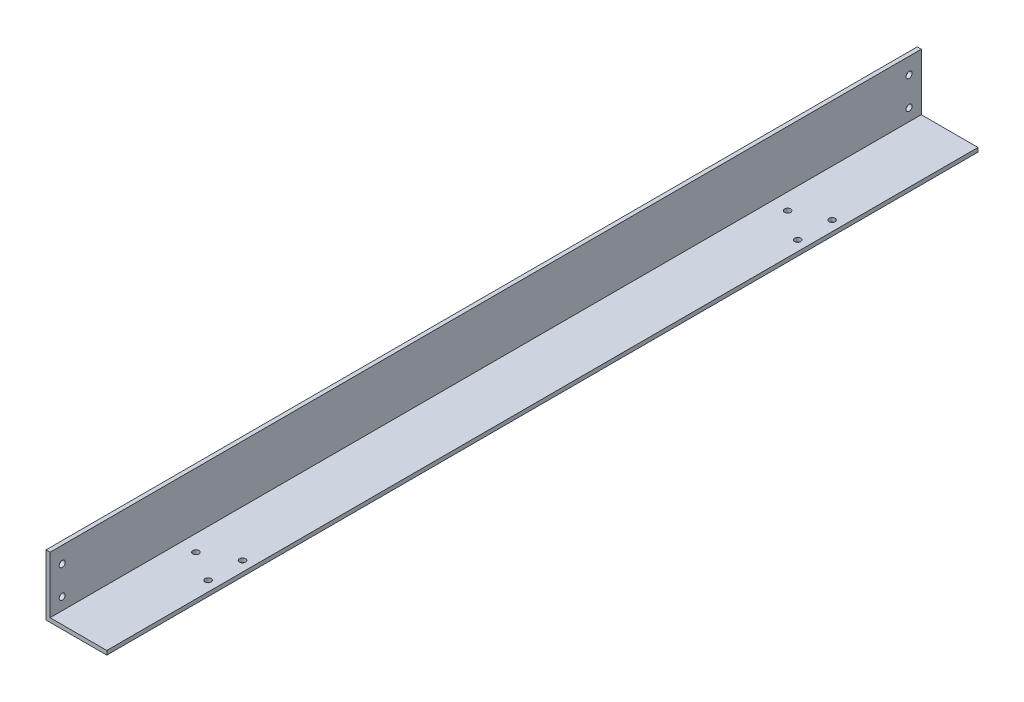
ISO-10303-21;
HEADER;
FILE_DESCRIPTION(('STEP AP214'),'2;1');
FILE_NAME('part.step','',(''),(''),'','','');
FILE_SCHEMA(('AUTOMOTIVE_DESIGN { 1 0 10303 214 1 1 1 1 }'));
ENDSEC;
DATA;
#1=APPLICATION_CONTEXT('core data for automotive mechanical design processes');
#2=APPLICATION_PROTOCOL_DEFINITION('international standard','automotive_design',2000,#1);
#3=PRODUCT_CONTEXT('',#1,'mechanical');
#4=PRODUCT('Part','Part','',(#3));
#5=PRODUCT_RELATED_PRODUCT_CATEGORY('part','',(#4));
#6=PRODUCT_DEFINITION_FORMATION('','',#4);
#7=PRODUCT_DEFINITION_CONTEXT('part definition',#1,'design');
#8=PRODUCT_DEFINITION('design','',#6,#7);
#9=PRODUCT_DEFINITION_SHAPE('','',#8);
#10=(LENGTH_UNIT() NAMED_UNIT(*) SI_UNIT(.MILLI.,.METRE.));
#11=(NAMED_UNIT(*) PLANE_ANGLE_UNIT() SI_UNIT($,.RADIAN.));
#12=(NAMED_UNIT(*) SI_UNIT($,.STERADIAN.) SOLID_ANGLE_UNIT());
#13=UNCERTAINTY_MEASURE_WITH_UNIT(LENGTH_MEASURE(1.E-05),#10,'distance_accuracy_value','');
#14=(GEOMETRIC_REPRESENTATION_CONTEXT(3) GLOBAL_UNCERTAINTY_ASSIGNED_CONTEXT((#13)) GLOBAL_UNIT_ASSIGNED_CONTEXT((#10,
#11,#12)) REPRESENTATION_CONTEXT('',''));
#15=CARTESIAN_POINT('',(0.,0.,0.));
#16=DIRECTION('',(0.,0.,1.));
#17=DIRECTION('',(1.,0.,0.));
#18=AXIS2_PLACEMENT_3D('',#15,#16,#17);
#19=CARTESIAN_POINT('',(30.,5.60231842899837,-19.999999999968));
#20=DIRECTION('',(0.,-1.,0.));
#21=DIRECTION('',(1.,0.,0.));
#22=AXIS2_PLACEMENT_3D('',#19,#20,#21);
#23=PLANE('',#22);
#24=CARTESIAN_POINT('',(25.,5.60231842899837,46.9999999999995));
#25=DIRECTION('',(0.,-1.,0.));
#26=DIRECTION('',(0.,0.,-1.));
#27=AXIS2_PLACEMENT_3D('',#24,#25,#26);
#28=CIRCLE('',#27,1.49999999999999);
#29=CARTESIAN_POINT('',(25.,5.60231842899837,45.4999999999995));
#30=VERTEX_POINT('',#29);
#31=EDGE_CURVE('E278',#30,#30,#28,.T.);
#32=ORIENTED_EDGE('',*,*,#31,.F.);
#33=EDGE_LOOP('',(#32));
#34=FACE_BOUND('',#33,.T.);
#35=CARTESIAN_POINT('',(25.,5.60231842899837,63.9999999999994));
#36=DIRECTION('',(0.,-1.,0.));
#37=DIRECTION('',(0.,0.,-1.));
#38=AXIS2_PLACEMENT_3D('',#35,#36,#37);
#39=CIRCLE('',#38,1.49999999999999);
#40=CARTESIAN_POINT('',(25.,5.60231842899837,62.4999999999995));
#41=VERTEX_POINT('',#40);
#42=EDGE_CURVE('E280',#41,#41,#39,.T.);
#43=ORIENTED_EDGE('',*,*,#42,.F.);
#44=EDGE_LOOP('',(#43));
#45=FACE_BOUND('',#44,.T.);
#46=CARTESIAN_POINT('',(9.99999999999999,5.60231842899837,53.9999999999994));
#47=DIRECTION('',(0.,-1.,0.));
#48=DIRECTION('',(0.,0.,-1.));
#49=AXIS2_PLACEMENT_3D('',#46,#47,#48);
#50=CIRCLE('',#49,1.49999999999999);
#51=CARTESIAN_POINT('',(9.99999999999999,5.60231842899837,52.4999999999995));
#52=VERTEX_POINT('',#51);
#53=EDGE_CURVE('E159',#52,#52,#50,.T.);
#54=ORIENTED_EDGE('',*,*,#53,.F.);
#55=EDGE_LOOP('',(#54));
#56=FACE_BOUND('',#55,.T.);
#57=CARTESIAN_POINT('',(25.,5.60231842899837,355.));
#58=DIRECTION('',(0.,-1.,0.));
#59=DIRECTION('',(0.,0.,-1.));
#60=AXIS2_PLACEMENT_3D('',#57,#58,#59);
#61=CIRCLE('',#60,1.49999999999999);
#62=CARTESIAN_POINT('',(25.,5.60231842899837,353.5));
#63=VERTEX_POINT('',#62);
#64=EDGE_CURVE('E148',#63,#63,#61,.T.);
#65=ORIENTED_EDGE('',*,*,#64,.F.);
#66=EDGE_LOOP('',(#65));
#67=FACE_BOUND('',#66,.T.);
#68=CARTESIAN_POINT('',(9.99999999999999,5.60231842899837,346.));
#69=DIRECTION('',(0.,-1.,0.));
#70=DIRECTION('',(0.,0.,-1.));
#71=AXIS2_PLACEMENT_3D('',#68,#69,#70);
#72=CIRCLE('',#71,1.49999999999999);
#73=CARTESIAN_POINT('',(9.99999999999999,5.60231842899837,344.5));
#74=VERTEX_POINT('',#73);
#75=EDGE_CURVE('E145',#74,#74,#72,.T.);
#76=ORIENTED_EDGE('',*,*,#75,.F.);
#77=EDGE_LOOP('',(#76));
#78=FACE_BOUND('',#77,.T.);
#79=CARTESIAN_POINT('',(25.,5.60231842899837,338.));
#80=DIRECTION('',(0.,-1.,0.));
#81=DIRECTION('',(0.,0.,-1.));
#82=AXIS2_PLACEMENT_3D('',#79,#80,#81);
#83=CIRCLE('',#82,1.49999999999999);
#84=CARTESIAN_POINT('',(25.,5.60231842899837,336.5));
#85=VERTEX_POINT('',#84);
#86=EDGE_CURVE('E144',#85,#85,#83,.T.);
#87=ORIENTED_EDGE('',*,*,#86,.F.);
#88=EDGE_LOOP('',(#87));
#89=FACE_BOUND('',#88,.T.);
#90=DIRECTION('',(0.,0.,1.));
#91=VECTOR('',#90,1.);
#92=CARTESIAN_POINT('',(30.,5.60231842899837,-19.999999999968));
#93=LINE('',#92,#91);
#94=CARTESIAN_POINT('',(30.,5.60231842899837,-19.999999999968));
#95=VERTEX_POINT('',#94);
#96=CARTESIAN_POINT('',(30.,5.60231842899837,410.));
#97=VERTEX_POINT('',#96);
#98=EDGE_CURVE('E87',#95,#97,#93,.T.);
#99=ORIENTED_EDGE('',*,*,#98,.T.);
#100=DIRECTION('',(1.,0.,0.));
#101=VECTOR('',#100,1.);
#102=CARTESIAN_POINT('',(30.,5.60231842899837,410.));
#103=LINE('',#102,#101);
#104=CARTESIAN_POINT('',(0.,5.60231842899837,410.));
#105=VERTEX_POINT('',#104);
#106=EDGE_CURVE('E90',#105,#97,#103,.T.);
#107=ORIENTED_EDGE('',*,*,#106,.F.);
#108=DIRECTION('',(0.,0.,1.));
#109=VECTOR('',#108,1.);
#110=CARTESIAN_POINT('',(0.,5.60231842899837,-19.999999999968));
#111=LINE('',#110,#109);
#112=CARTESIAN_POINT('',(0.,5.60231842899837,-19.999999999968));
#113=VERTEX_POINT('',#112);
#114=EDGE_CURVE('E11',#113,#105,#111,.T.);
#115=ORIENTED_EDGE('',*,*,#114,.F.);
#116=DIRECTION('',(1.,0.,0.));
#117=VECTOR('',#116,1.);
#118=CARTESIAN_POINT('',(30.,5.60231842899837,-19.999999999968));
#119=LINE('',#118,#117);
#120=EDGE_CURVE('E91',#113,#95,#119,.T.);
#121=ORIENTED_EDGE('',*,*,#120,.T.);
#122=EDGE_LOOP('',(#99,#107,#115,#121));
#123=FACE_BOUND('',#122,.T.);
#124=ADVANCED_FACE('F37',(#34,#45,#56,#67,#78,#89,#123),#23,.T.);
#125=CARTESIAN_POINT('',(0.,5.60231842899837,-19.999999999968));
#126=DIRECTION('',(-1.,0.,0.));
#127=DIRECTION('',(0.,0.,1.));
#128=AXIS2_PLACEMENT_3D('',#125,#126,#127);
#129=PLANE('',#128);
#130=CARTESIAN_POINT('',(0.,13.6023184289984,-14.0000000000006));
#131=DIRECTION('',(1.,0.,0.));
#132=DIRECTION('',(0.,0.,-1.));
#133=AXIS2_PLACEMENT_3D('',#130,#131,#132);
#134=CIRCLE('',#133,1.5);
#135=CARTESIAN_POINT('',(0.,13.6023184289984,-15.5000000000006));
#136=VERTEX_POINT('',#135);
#137=EDGE_CURVE('E171',#136,#136,#134,.T.);
#138=ORIENTED_EDGE('',*,*,#137,.T.);
#139=EDGE_LOOP('',(#138));
#140=FACE_BOUND('',#139,.T.);
#141=CARTESIAN_POINT('',(0.,27.6023184289984,-14.0000000000006));
#142=DIRECTION('',(1.,0.,0.));
#143=DIRECTION('',(0.,0.,-1.));
#144=AXIS2_PLACEMENT_3D('',#141,#142,#143);
#145=CIRCLE('',#144,1.5);
#146=CARTESIAN_POINT('',(0.,27.6023184289984,-15.5000000000006));
#147=VERTEX_POINT('',#146);
#148=EDGE_CURVE('E177',#147,#147,#145,.T.);
#149=ORIENTED_EDGE('',*,*,#148,.T.);
#150=EDGE_LOOP('',(#149));
#151=FACE_BOUND('',#150,.T.);
#152=CARTESIAN_POINT('',(0.,13.6023184289983,404.));
#153=DIRECTION('',(1.,0.,0.));
#154=DIRECTION('',(0.,0.,-1.));
#155=AXIS2_PLACEMENT_3D('',#152,#153,#154);
#156=CIRCLE('',#155,1.49999999999999);
#157=CARTESIAN_POINT('',(0.,13.6023184289983,402.5));
#158=VERTEX_POINT('',#157);
#159=EDGE_CURVE('E183',#158,#158,#156,.T.);
#160=ORIENTED_EDGE('',*,*,#159,.T.);
#161=EDGE_LOOP('',(#160));
#162=FACE_BOUND('',#161,.T.);
#163=CARTESIAN_POINT('',(0.,27.6023184289983,404.));
#164=DIRECTION('',(1.,0.,0.));
#165=DIRECTION('',(0.,0.,-1.));
#166=AXIS2_PLACEMENT_3D('',#163,#164,#165);
#167=CIRCLE('',#166,1.49999999999999);
#168=CARTESIAN_POINT('',(0.,27.6023184289983,402.5));
#169=VERTEX_POINT('',#168);
#170=EDGE_CURVE('E110',#169,#169,#167,.T.);
#171=ORIENTED_EDGE('',*,*,#170,.T.);
#172=EDGE_LOOP('',(#171));
#173=FACE_BOUND('',#172,.T.);
#174=ORIENTED_EDGE('',*,*,#114,.T.);
#175=DIRECTION('',(0.,-1.,0.));
#176=VECTOR('',#175,1.);
#177=CARTESIAN_POINT('',(0.,5.60231842899837,410.));
#178=LINE('',#177,#176);
#179=CARTESIAN_POINT('',(0.,35.6023184289984,410.));
#180=VERTEX_POINT('',#179);
#181=EDGE_CURVE('E109',#180,#105,#178,.T.);
#182=ORIENTED_EDGE('',*,*,#181,.F.);
#183=DIRECTION('',(0.,0.,1.));
#184=VECTOR('',#183,1.);
#185=CARTESIAN_POINT('',(0.,35.6023184289984,-19.999999999968));
#186=LINE('',#185,#184);
#187=CARTESIAN_POINT('',(0.,35.6023184289984,-19.999999999968));
#188=VERTEX_POINT('',#187);
#189=EDGE_CURVE('E45',#188,#180,#186,.T.);
#190=ORIENTED_EDGE('',*,*,#189,.F.);
#191=DIRECTION('',(0.,-1.,0.));
#192=VECTOR('',#191,1.);
#193=CARTESIAN_POINT('',(0.,5.60231842899837,-19.999999999968));
#194=LINE('',#193,#192);
#195=EDGE_CURVE('E96',#188,#113,#194,.T.);
#196=ORIENTED_EDGE('',*,*,#195,.T.);
#197=EDGE_LOOP('',(#174,#182,#190,#196));
#198=FACE_BOUND('',#197,.T.);
#199=ADVANCED_FACE('F205',(#140,#151,#162,#173,#198),#129,.T.);
#200=CARTESIAN_POINT('',(0.,35.6023184289984,-19.999999999968));
#201=DIRECTION('',(0.,1.,0.));
#202=DIRECTION('',(0.,0.,1.));
#203=AXIS2_PLACEMENT_3D('',#200,#201,#202);
#204=PLANE('',#203);
#205=ORIENTED_EDGE('',*,*,#189,.T.);
#206=DIRECTION('',(-1.,0.,0.));
#207=VECTOR('',#206,1.);
#208=CARTESIAN_POINT('',(0.,35.6023184289984,410.));
#209=LINE('',#208,#207);
#210=CARTESIAN_POINT('',(2.,35.6023184289984,410.));
#211=VERTEX_POINT('',#210);
#212=EDGE_CURVE('E121',#211,#180,#209,.T.);
#213=ORIENTED_EDGE('',*,*,#212,.F.);
#214=DIRECTION('',(0.,0.,1.));
#215=VECTOR('',#214,1.);
#216=CARTESIAN_POINT('',(2.,35.6023184289984,-19.999999999968));
#217=LINE('',#216,#215);
#218=CARTESIAN_POINT('',(2.,35.6023184289984,-19.999999999968));
#219=VERTEX_POINT('',#218);
#220=EDGE_CURVE('E137',#219,#211,#217,.T.);
#221=ORIENTED_EDGE('',*,*,#220,.F.);
#222=DIRECTION('',(-1.,0.,0.));
#223=VECTOR('',#222,1.);
#224=CARTESIAN_POINT('',(0.,35.6023184289984,-19.999999999968));
#225=LINE('',#224,#223);
#226=EDGE_CURVE('E133',#219,#188,#225,.T.);
#227=ORIENTED_EDGE('',*,*,#226,.T.);
#228=EDGE_LOOP('',(#205,#213,#221,#227));
#229=FACE_BOUND('',#228,.T.);
#230=ADVANCED_FACE('F194',(#229),#204,.T.);
#231=CARTESIAN_POINT('',(2.,35.6023184289984,-19.999999999968));
#232=DIRECTION('',(1.,0.,0.));
#233=DIRECTION('',(0.,1.,0.));
#234=AXIS2_PLACEMENT_3D('',#231,#232,#233);
#235=PLANE('',#234);
#236=CARTESIAN_POINT('',(2.,13.6023184289984,-14.0000000000006));
#237=DIRECTION('',(1.,0.,0.));
#238=DIRECTION('',(0.,0.,-1.));
#239=AXIS2_PLACEMENT_3D('',#236,#237,#238);
#240=CIRCLE('',#239,1.49999999999999);
#241=CARTESIAN_POINT('',(2.,13.6023184289984,-15.5000000000006));
#242=VERTEX_POINT('',#241);
#243=EDGE_CURVE('E168',#242,#242,#240,.T.);
#244=ORIENTED_EDGE('',*,*,#243,.F.);
#245=EDGE_LOOP('',(#244));
#246=FACE_BOUND('',#245,.T.);
#247=CARTESIAN_POINT('',(2.,27.6023184289984,-14.0000000000006));
#248=DIRECTION('',(1.,0.,0.));
#249=DIRECTION('',(0.,0.,-1.));
#250=AXIS2_PLACEMENT_3D('',#247,#248,#249);
#251=CIRCLE('',#250,1.49999999999999);
#252=CARTESIAN_POINT('',(2.,27.6023184289984,-15.5000000000006));
#253=VERTEX_POINT('',#252);
#254=EDGE_CURVE('E174',#253,#253,#251,.T.);
#255=ORIENTED_EDGE('',*,*,#254,.F.);
#256=EDGE_LOOP('',(#255));
#257=FACE_BOUND('',#256,.T.);
#258=CARTESIAN_POINT('',(1.99999999999995,13.6023184289983,404.));
#259=DIRECTION('',(1.,0.,0.));
#260=DIRECTION('',(0.,0.,-1.));
#261=AXIS2_PLACEMENT_3D('',#258,#259,#260);
#262=CIRCLE('',#261,1.49999999999999);
#263=CARTESIAN_POINT('',(1.99999999999995,13.6023184289983,402.5));
#264=VERTEX_POINT('',#263);
#265=EDGE_CURVE('E180',#264,#264,#262,.T.);
#266=ORIENTED_EDGE('',*,*,#265,.F.);
#267=EDGE_LOOP('',(#266));
#268=FACE_BOUND('',#267,.T.);
#269=CARTESIAN_POINT('',(1.99999999999994,27.6023184289983,404.));
#270=DIRECTION('',(1.,0.,0.));
#271=DIRECTION('',(0.,0.,-1.));
#272=AXIS2_PLACEMENT_3D('',#269,#270,#271);
#273=CIRCLE('',#272,1.49999999999999);
#274=CARTESIAN_POINT('',(1.99999999999994,27.6023184289983,402.5));
#275=VERTEX_POINT('',#274);
#276=EDGE_CURVE('E113',#275,#275,#273,.T.);
#277=ORIENTED_EDGE('',*,*,#276,.F.);
#278=EDGE_LOOP('',(#277));
#279=FACE_BOUND('',#278,.T.);
#280=ORIENTED_EDGE('',*,*,#220,.T.);
#281=DIRECTION('',(0.,1.,0.));
#282=VECTOR('',#281,1.);
#283=CARTESIAN_POINT('',(2.,35.6023184289984,410.));
#284=LINE('',#283,#282);
#285=CARTESIAN_POINT('',(2.,7.60231842899837,410.));
#286=VERTEX_POINT('',#285);
#287=EDGE_CURVE('E118',#286,#211,#284,.T.);
#288=ORIENTED_EDGE('',*,*,#287,.F.);
#289=DIRECTION('',(0.,0.,1.));
#290=VECTOR('',#289,1.);
#291=CARTESIAN_POINT('',(2.,7.60231842899837,-19.999999999968));
#292=LINE('',#291,#290);
#293=CARTESIAN_POINT('',(2.,7.60231842899837,-19.999999999968));
#294=VERTEX_POINT('',#293);
#295=EDGE_CURVE('E139',#294,#286,#292,.T.);
#296=ORIENTED_EDGE('',*,*,#295,.F.);
#297=DIRECTION('',(0.,1.,0.));
#298=VECTOR('',#297,1.);
#299=CARTESIAN_POINT('',(2.,35.6023184289984,-19.999999999968));
#300=LINE('',#299,#298);
#301=EDGE_CURVE('E130',#294,#219,#300,.T.);
#302=ORIENTED_EDGE('',*,*,#301,.T.);
#303=EDGE_LOOP('',(#280,#288,#296,#302));
#304=FACE_BOUND('',#303,.T.);
#305=ADVANCED_FACE('F190',(#246,#257,#268,#279,#304),#235,.T.);
#306=CARTESIAN_POINT('',(2.,7.60231842899837,-19.999999999968));
#307=DIRECTION('',(0.,1.,0.));
#308=DIRECTION('',(0.,0.,1.));
#309=AXIS2_PLACEMENT_3D('',#306,#307,#308);
#310=PLANE('',#309);
#311=CARTESIAN_POINT('',(25.,7.60231842899837,46.9999999999995));
#312=DIRECTION('',(0.,1.,0.));
#313=DIRECTION('',(0.,0.,1.));
#314=AXIS2_PLACEMENT_3D('',#311,#312,#313);
#315=CIRCLE('',#314,1.49999999999999);
#316=CARTESIAN_POINT('',(25.,7.60231842899837,48.4999999999994));
#317=VERTEX_POINT('',#316);
#318=EDGE_CURVE('E275',#317,#317,#315,.T.);
#319=ORIENTED_EDGE('',*,*,#318,.F.);
#320=EDGE_LOOP('',(#319));
#321=FACE_BOUND('',#320,.T.);
#322=CARTESIAN_POINT('',(25.,7.60231842899837,63.9999999999994));
#323=DIRECTION('',(0.,1.,0.));
#324=DIRECTION('',(0.,0.,1.));
#325=AXIS2_PLACEMENT_3D('',#322,#323,#324);
#326=CIRCLE('',#325,1.49999999999999);
#327=CARTESIAN_POINT('',(25.,7.60231842899837,65.4999999999994));
#328=VERTEX_POINT('',#327);
#329=EDGE_CURVE('E40',#328,#328,#326,.T.);
#330=ORIENTED_EDGE('',*,*,#329,.F.);
#331=EDGE_LOOP('',(#330));
#332=FACE_BOUND('',#331,.T.);
#333=CARTESIAN_POINT('',(9.99999999999999,7.60231842899837,53.9999999999994));
#334=DIRECTION('',(0.,1.,0.));
#335=DIRECTION('',(0.,0.,1.));
#336=AXIS2_PLACEMENT_3D('',#333,#334,#335);
#337=CIRCLE('',#336,1.49999999999999);
#338=CARTESIAN_POINT('',(9.99999999999999,7.60231842899837,55.4999999999994));
#339=VERTEX_POINT('',#338);
#340=EDGE_CURVE('E154',#339,#339,#337,.T.);
#341=ORIENTED_EDGE('',*,*,#340,.F.);
#342=EDGE_LOOP('',(#341));
#343=FACE_BOUND('',#342,.T.);
#344=CARTESIAN_POINT('',(25.,7.60231842899837,355.));
#345=DIRECTION('',(0.,1.,0.));
#346=DIRECTION('',(0.,0.,1.));
#347=AXIS2_PLACEMENT_3D('',#344,#345,#346);
#348=CIRCLE('',#347,1.49999999999999);
#349=CARTESIAN_POINT('',(25.,7.60231842899837,356.5));
#350=VERTEX_POINT('',#349);
#351=EDGE_CURVE('E146',#350,#350,#348,.T.);
#352=ORIENTED_EDGE('',*,*,#351,.F.);
#353=EDGE_LOOP('',(#352));
#354=FACE_BOUND('',#353,.T.);
#355=CARTESIAN_POINT('',(9.99999999999999,7.60231842899837,346.));
#356=DIRECTION('',(0.,1.,0.));
#357=DIRECTION('',(0.,0.,1.));
#358=AXIS2_PLACEMENT_3D('',#355,#356,#357);
#359=CIRCLE('',#358,1.49999999999999);
#360=CARTESIAN_POINT('',(9.99999999999999,7.60231842899837,347.5));
#361=VERTEX_POINT('',#360);
#362=EDGE_CURVE('E142',#361,#361,#359,.T.);
#363=ORIENTED_EDGE('',*,*,#362,.F.);
#364=EDGE_LOOP('',(#363));
#365=FACE_BOUND('',#364,.T.);
#366=CARTESIAN_POINT('',(25.,7.60231842899837,338.));
#367=DIRECTION('',(0.,1.,0.));
#368=DIRECTION('',(0.,0.,1.));
#369=AXIS2_PLACEMENT_3D('',#366,#367,#368);
#370=CIRCLE('',#369,1.49999999999999);
#371=CARTESIAN_POINT('',(25.,7.60231842899837,339.5));
#372=VERTEX_POINT('',#371);
#373=EDGE_CURVE('E165',#372,#372,#370,.T.);
#374=ORIENTED_EDGE('',*,*,#373,.F.);
#375=EDGE_LOOP('',(#374));
#376=FACE_BOUND('',#375,.T.);
#377=ORIENTED_EDGE('',*,*,#295,.T.);
#378=DIRECTION('',(-1.,0.,0.));
#379=VECTOR('',#378,1.);
#380=CARTESIAN_POINT('',(2.,7.60231842899837,410.));
#381=LINE('',#380,#379);
#382=CARTESIAN_POINT('',(30.,7.60231842899837,410.));
#383=VERTEX_POINT('',#382);
#384=EDGE_CURVE('E104',#383,#286,#381,.T.);
#385=ORIENTED_EDGE('',*,*,#384,.F.);
#386=DIRECTION('',(0.,0.,1.));
#387=VECTOR('',#386,1.);
#388=CARTESIAN_POINT('',(30.,7.60231842899837,-19.999999999968));
#389=LINE('',#388,#387);
#390=CARTESIAN_POINT('',(30.,7.60231842899837,-19.999999999968));
#391=VERTEX_POINT('',#390);
#392=EDGE_CURVE('E95',#391,#383,#389,.T.);
#393=ORIENTED_EDGE('',*,*,#392,.F.);
#394=DIRECTION('',(-1.,0.,0.));
#395=VECTOR('',#394,1.);
#396=CARTESIAN_POINT('',(2.,7.60231842899837,-19.999999999968));
#397=LINE('',#396,#395);
#398=EDGE_CURVE('E127',#391,#294,#397,.T.);
#399=ORIENTED_EDGE('',*,*,#398,.T.);
#400=EDGE_LOOP('',(#377,#385,#393,#399));
#401=FACE_BOUND('',#400,.T.);
#402=ADVANCED_FACE('F193',(#321,#332,#343,#354,#365,#376,#401),#310,.T.);
#403=CARTESIAN_POINT('',(30.,7.60231842899837,-19.999999999968));
#404=DIRECTION('',(1.,0.,0.));
#405=DIRECTION('',(0.,0.,-1.));
#406=AXIS2_PLACEMENT_3D('',#403,#404,#405);
#407=PLANE('',#406);
#408=ORIENTED_EDGE('',*,*,#392,.T.);
#409=DIRECTION('',(0.,1.,0.));
#410=VECTOR('',#409,1.);
#411=CARTESIAN_POINT('',(30.,7.60231842899837,410.));
#412=LINE('',#411,#410);
#413=EDGE_CURVE('E99',#97,#383,#412,.T.);
#414=ORIENTED_EDGE('',*,*,#413,.F.);
#415=ORIENTED_EDGE('',*,*,#98,.F.);
#416=DIRECTION('',(0.,1.,0.));
#417=VECTOR('',#416,1.);
#418=CARTESIAN_POINT('',(30.,7.60231842899837,-19.999999999968));
#419=LINE('',#418,#417);
#420=EDGE_CURVE('E125',#95,#391,#419,.T.);
#421=ORIENTED_EDGE('',*,*,#420,.T.);
#422=EDGE_LOOP('',(#408,#414,#415,#421));
#423=FACE_BOUND('',#422,.T.);
#424=ADVANCED_FACE('F100',(#423),#407,.T.);
#425=CARTESIAN_POINT('',(0.,0.,-19.999999999968));
#426=DIRECTION('',(0.,0.,-1.));
#427=DIRECTION('',(-1.,0.,0.));
#428=AXIS2_PLACEMENT_3D('',#425,#426,#427);
#429=PLANE('',#428);
#430=ORIENTED_EDGE('',*,*,#120,.F.);
#431=ORIENTED_EDGE('',*,*,#195,.F.);
#432=ORIENTED_EDGE('',*,*,#226,.F.);
#433=ORIENTED_EDGE('',*,*,#301,.F.);
#434=ORIENTED_EDGE('',*,*,#398,.F.);
#435=ORIENTED_EDGE('',*,*,#420,.F.);
#436=EDGE_LOOP('',(#430,#431,#432,#433,#434,#435));
#437=FACE_BOUND('',#436,.T.);
#438=ADVANCED_FACE('F204',(#437),#429,.T.);
#439=CARTESIAN_POINT('',(0.,0.,410.));
#440=DIRECTION('',(0.,0.,-1.));
#441=DIRECTION('',(-1.,0.,0.));
#442=AXIS2_PLACEMENT_3D('',#439,#440,#441);
#443=PLANE('',#442);
#444=ORIENTED_EDGE('',*,*,#106,.T.);
#445=ORIENTED_EDGE('',*,*,#413,.T.);
#446=ORIENTED_EDGE('',*,*,#384,.T.);
#447=ORIENTED_EDGE('',*,*,#287,.T.);
#448=ORIENTED_EDGE('',*,*,#212,.T.);
#449=ORIENTED_EDGE('',*,*,#181,.T.);
#450=EDGE_LOOP('',(#444,#445,#446,#447,#448,#449));
#451=FACE_BOUND('',#450,.T.);
#452=ADVANCED_FACE('F107',(#451),#443,.F.);
#453=CARTESIAN_POINT('',(1.99999999999994,27.6023184289983,404.));
#454=DIRECTION('',(1.,0.,0.));
#455=DIRECTION('',(0.,0.,-1.));
#456=AXIS2_PLACEMENT_3D('',#453,#454,#455);
#457=CYLINDRICAL_SURFACE('',#456,1.49999999999999);
#458=ORIENTED_EDGE('',*,*,#170,.F.);
#459=EDGE_LOOP('',(#458));
#460=FACE_BOUND('',#459,.T.);
#461=ORIENTED_EDGE('',*,*,#276,.T.);
#462=EDGE_LOOP('',(#461));
#463=FACE_BOUND('',#462,.T.);
#464=ADVANCED_FACE('F188',(#460,#463),#457,.F.);
#465=CARTESIAN_POINT('',(1.99999999999994,13.6023184289983,404.));
#466=DIRECTION('',(1.,0.,0.));
#467=DIRECTION('',(0.,0.,-1.));
#468=AXIS2_PLACEMENT_3D('',#465,#466,#467);
#469=CYLINDRICAL_SURFACE('',#468,1.49999999999999);
#470=ORIENTED_EDGE('',*,*,#159,.F.);
#471=EDGE_LOOP('',(#470));
#472=FACE_BOUND('',#471,.T.);
#473=ORIENTED_EDGE('',*,*,#265,.T.);
#474=EDGE_LOOP('',(#473));
#475=FACE_BOUND('',#474,.T.);
#476=ADVANCED_FACE('F233',(#472,#475),#469,.F.);
#477=CARTESIAN_POINT('',(2.,27.6023184289984,-14.0000000000006));
#478=DIRECTION('',(1.,0.,0.));
#479=DIRECTION('',(0.,0.,-1.));
#480=AXIS2_PLACEMENT_3D('',#477,#478,#479);
#481=CYLINDRICAL_SURFACE('',#480,1.49999999999999);
#482=ORIENTED_EDGE('',*,*,#148,.F.);
#483=EDGE_LOOP('',(#482));
#484=FACE_BOUND('',#483,.T.);
#485=ORIENTED_EDGE('',*,*,#254,.T.);
#486=EDGE_LOOP('',(#485));
#487=FACE_BOUND('',#486,.T.);
#488=ADVANCED_FACE('F239',(#484,#487),#481,.F.);
#489=CARTESIAN_POINT('',(2.,13.6023184289984,-14.0000000000006));
#490=DIRECTION('',(1.,0.,0.));
#491=DIRECTION('',(0.,0.,-1.));
#492=AXIS2_PLACEMENT_3D('',#489,#490,#491);
#493=CYLINDRICAL_SURFACE('',#492,1.49999999999999);
#494=ORIENTED_EDGE('',*,*,#137,.F.);
#495=EDGE_LOOP('',(#494));
#496=FACE_BOUND('',#495,.T.);
#497=ORIENTED_EDGE('',*,*,#243,.T.);
#498=EDGE_LOOP('',(#497));
#499=FACE_BOUND('',#498,.T.);
#500=ADVANCED_FACE('F243',(#496,#499),#493,.F.);
#501=CARTESIAN_POINT('',(25.,5.60231842899837,338.));
#502=DIRECTION('',(0.,-1.,0.));
#503=DIRECTION('',(0.,0.,-1.));
#504=AXIS2_PLACEMENT_3D('',#501,#502,#503);
#505=CYLINDRICAL_SURFACE('',#504,1.49999999999999);
#506=ORIENTED_EDGE('',*,*,#373,.T.);
#507=EDGE_LOOP('',(#506));
#508=FACE_BOUND('',#507,.T.);
#509=ORIENTED_EDGE('',*,*,#86,.T.);
#510=EDGE_LOOP('',(#509));
#511=FACE_BOUND('',#510,.T.);
#512=ADVANCED_FACE('F247',(#508,#511),#505,.F.);
#513=CARTESIAN_POINT('',(9.99999999999999,5.60231842899837,346.));
#514=DIRECTION('',(0.,-1.,0.));
#515=DIRECTION('',(0.,0.,-1.));
#516=AXIS2_PLACEMENT_3D('',#513,#514,#515);
#517=CYLINDRICAL_SURFACE('',#516,1.49999999999999);
#518=ORIENTED_EDGE('',*,*,#362,.T.);
#519=EDGE_LOOP('',(#518));
#520=FACE_BOUND('',#519,.T.);
#521=ORIENTED_EDGE('',*,*,#75,.T.);
#522=EDGE_LOOP('',(#521));
#523=FACE_BOUND('',#522,.T.);
#524=ADVANCED_FACE('F251',(#520,#523),#517,.F.);
#525=CARTESIAN_POINT('',(25.,5.60231842899837,355.));
#526=DIRECTION('',(0.,-1.,0.));
#527=DIRECTION('',(0.,0.,-1.));
#528=AXIS2_PLACEMENT_3D('',#525,#526,#527);
#529=CYLINDRICAL_SURFACE('',#528,1.49999999999999);
#530=ORIENTED_EDGE('',*,*,#351,.T.);
#531=EDGE_LOOP('',(#530));
#532=FACE_BOUND('',#531,.T.);
#533=ORIENTED_EDGE('',*,*,#64,.T.);
#534=EDGE_LOOP('',(#533));
#535=FACE_BOUND('',#534,.T.);
#536=ADVANCED_FACE('F255',(#532,#535),#529,.F.);
#537=CARTESIAN_POINT('',(9.99999999999999,5.60231842899837,53.9999999999994));
#538=DIRECTION('',(0.,-1.,0.));
#539=DIRECTION('',(0.,0.,-1.));
#540=AXIS2_PLACEMENT_3D('',#537,#538,#539);
#541=CYLINDRICAL_SURFACE('',#540,1.49999999999999);
#542=ORIENTED_EDGE('',*,*,#340,.T.);
#543=EDGE_LOOP('',(#542));
#544=FACE_BOUND('',#543,.T.);
#545=ORIENTED_EDGE('',*,*,#53,.T.);
#546=EDGE_LOOP('',(#545));
#547=FACE_BOUND('',#546,.T.);
#548=ADVANCED_FACE('F259',(#544,#547),#541,.F.);
#549=CARTESIAN_POINT('',(25.,5.60231842899837,63.9999999999994));
#550=DIRECTION('',(0.,-1.,0.));
#551=DIRECTION('',(0.,0.,-1.));
#552=AXIS2_PLACEMENT_3D('',#549,#550,#551);
#553=CYLINDRICAL_SURFACE('',#552,1.49999999999999);
#554=ORIENTED_EDGE('',*,*,#329,.T.);
#555=EDGE_LOOP('',(#554));
#556=FACE_BOUND('',#555,.T.);
#557=ORIENTED_EDGE('',*,*,#42,.T.);
#558=EDGE_LOOP('',(#557));
#559=FACE_BOUND('',#558,.T.);
#560=ADVANCED_FACE('F262',(#556,#559),#553,.F.);
#561=CARTESIAN_POINT('',(25.,5.60231842899837,46.9999999999995));
#562=DIRECTION('',(0.,-1.,0.));
#563=DIRECTION('',(0.,0.,-1.));
#564=AXIS2_PLACEMENT_3D('',#561,#562,#563);
#565=CYLINDRICAL_SURFACE('',#564,1.49999999999999);
#566=ORIENTED_EDGE('',*,*,#318,.T.);
#567=EDGE_LOOP('',(#566));
#568=FACE_BOUND('',#567,.T.);
#569=ORIENTED_EDGE('',*,*,#31,.T.);
#570=EDGE_LOOP('',(#569));
#571=FACE_BOUND('',#570,.T.);
#572=ADVANCED_FACE('F266',(#568,#571),#565,.F.);
#573=CLOSED_SHELL('',(#124,#199,#230,#305,#402,#424,#438,#452,#464,#476,#488,#500,#512,#524,
#536,#548,#560,#572));
#574=MANIFOLD_SOLID_BREP('B2',#573);
#575=ADVANCED_BREP_SHAPE_REPRESENTATION('',(#18,#574),#14);
#576=SHAPE_DEFINITION_REPRESENTATION(#9,#575);
ENDSEC;
END-ISO-10303-21;
